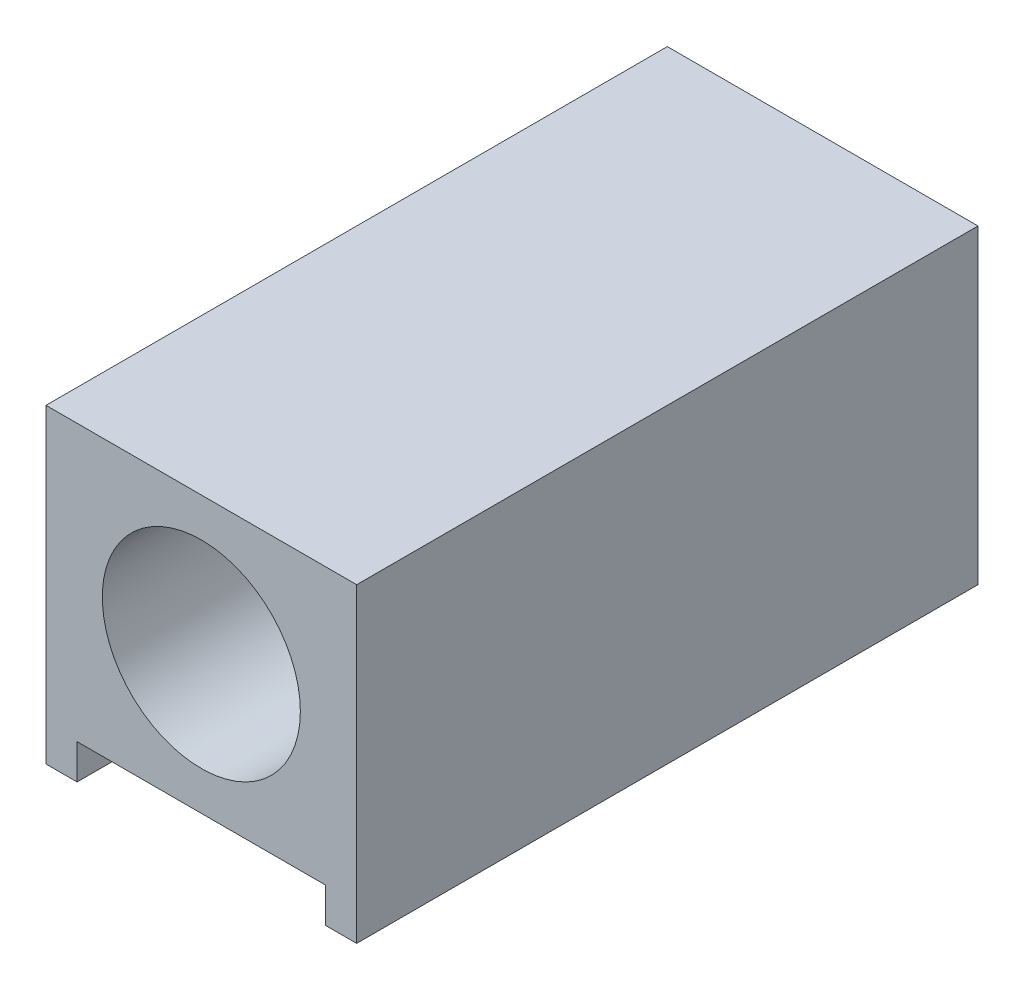
ISO-10303-21;
HEADER;
FILE_DESCRIPTION(('STEP AP214'),'2;1');
FILE_NAME('part.step','',(''),(''),'','','');
FILE_SCHEMA(('AUTOMOTIVE_DESIGN { 1 0 10303 214 1 1 1 1 }'));
ENDSEC;
DATA;
#1=APPLICATION_CONTEXT('core data for automotive mechanical design processes');
#2=APPLICATION_PROTOCOL_DEFINITION('international standard','automotive_design',2000,#1);
#3=PRODUCT_CONTEXT('',#1,'mechanical');
#4=PRODUCT('Part','Part','',(#3));
#5=PRODUCT_RELATED_PRODUCT_CATEGORY('part','',(#4));
#6=PRODUCT_DEFINITION_FORMATION('','',#4);
#7=PRODUCT_DEFINITION_CONTEXT('part definition',#1,'design');
#8=PRODUCT_DEFINITION('design','',#6,#7);
#9=PRODUCT_DEFINITION_SHAPE('','',#8);
#10=(LENGTH_UNIT() NAMED_UNIT(*) SI_UNIT(.MILLI.,.METRE.));
#11=(NAMED_UNIT(*) PLANE_ANGLE_UNIT() SI_UNIT($,.RADIAN.));
#12=(NAMED_UNIT(*) SI_UNIT($,.STERADIAN.) SOLID_ANGLE_UNIT());
#13=UNCERTAINTY_MEASURE_WITH_UNIT(LENGTH_MEASURE(1.E-05),#10,'distance_accuracy_value','');
#14=(GEOMETRIC_REPRESENTATION_CONTEXT(3) GLOBAL_UNCERTAINTY_ASSIGNED_CONTEXT((#13)) GLOBAL_UNIT_ASSIGNED_CONTEXT((#10,
#11,#12)) REPRESENTATION_CONTEXT('',''));
#15=CARTESIAN_POINT('',(0.,0.,0.));
#16=DIRECTION('',(0.,0.,1.));
#17=DIRECTION('',(1.,0.,0.));
#18=AXIS2_PLACEMENT_3D('',#15,#16,#17);
#19=CARTESIAN_POINT('',(0.,0.,0.));
#20=DIRECTION('',(0.,1.,0.));
#21=DIRECTION('',(0.,0.,1.));
#22=AXIS2_PLACEMENT_3D('',#19,#20,#21);
#23=PLANE('',#22);
#24=DIRECTION('',(1.,0.,0.));
#25=VECTOR('',#24,1.);
#26=CARTESIAN_POINT('',(-10.5609065155807,0.,12.71388101983));
#27=LINE('',#26,#25);
#28=CARTESIAN_POINT('',(-8.96090651558074,0.,12.71388101983));
#29=VERTEX_POINT('',#28);
#30=CARTESIAN_POINT('',(3.83909348441926,0.,12.71388101983));
#31=VERTEX_POINT('',#30);
#32=EDGE_CURVE('E192',#29,#31,#27,.T.);
#33=ORIENTED_EDGE('',*,*,#32,.F.);
#34=DIRECTION('',(0.,0.,1.));
#35=VECTOR('',#34,1.);
#36=CARTESIAN_POINT('',(-8.96090651558074,0.,-19.28611898017));
#37=LINE('',#36,#35);
#38=CARTESIAN_POINT('',(-8.96090651558074,0.,-19.28611898017));
#39=VERTEX_POINT('',#38);
#40=EDGE_CURVE('E174',#39,#29,#37,.T.);
#41=ORIENTED_EDGE('',*,*,#40,.F.);
#42=DIRECTION('',(-1.,0.,0.));
#43=VECTOR('',#42,1.);
#44=CARTESIAN_POINT('',(-10.5609065155807,0.,-19.28611898017));
#45=LINE('',#44,#43);
#46=CARTESIAN_POINT('',(3.83909348441926,0.,-19.28611898017));
#47=VERTEX_POINT('',#46);
#48=EDGE_CURVE('E197',#47,#39,#45,.T.);
#49=ORIENTED_EDGE('',*,*,#48,.F.);
#50=DIRECTION('',(0.,0.,-1.));
#51=VECTOR('',#50,1.);
#52=CARTESIAN_POINT('',(3.83909348441926,0.,-19.28611898017));
#53=LINE('',#52,#51);
#54=EDGE_CURVE('E161',#31,#47,#53,.T.);
#55=ORIENTED_EDGE('',*,*,#54,.F.);
#56=EDGE_LOOP('',(#33,#41,#49,#55));
#57=FACE_BOUND('',#56,.T.);
#58=ADVANCED_FACE('F33',(#57),#23,.F.);
#59=CARTESIAN_POINT('',(-10.5609065155807,14.2,-19.28611898017));
#60=DIRECTION('',(1.,0.,0.));
#61=DIRECTION('',(0.,0.,-1.));
#62=AXIS2_PLACEMENT_3D('',#59,#60,#61);
#63=PLANE('',#62);
#64=DIRECTION('',(0.,-1.,0.));
#65=VECTOR('',#64,1.);
#66=CARTESIAN_POINT('',(-10.5609065155807,14.2,-19.28611898017));
#67=LINE('',#66,#65);
#68=CARTESIAN_POINT('',(-10.5609065155807,14.2,-19.28611898017));
#69=VERTEX_POINT('',#68);
#70=CARTESIAN_POINT('',(-10.5609065155807,-1.8,-19.28611898017));
#71=VERTEX_POINT('',#70);
#72=EDGE_CURVE('E202',#69,#71,#67,.T.);
#73=ORIENTED_EDGE('',*,*,#72,.T.);
#74=DIRECTION('',(0.,0.,-1.));
#75=VECTOR('',#74,1.);
#76=CARTESIAN_POINT('',(-10.5609065155807,-1.8,-19.28611898017));
#77=LINE('',#76,#75);
#78=CARTESIAN_POINT('',(-10.5609065155807,-1.8,12.71388101983));
#79=VERTEX_POINT('',#78);
#80=EDGE_CURVE('E175',#79,#71,#77,.T.);
#81=ORIENTED_EDGE('',*,*,#80,.F.);
#82=DIRECTION('',(0.,-1.,0.));
#83=VECTOR('',#82,1.);
#84=CARTESIAN_POINT('',(-10.5609065155807,14.2,12.71388101983));
#85=LINE('',#84,#83);
#86=CARTESIAN_POINT('',(-10.5609065155807,14.2,12.71388101983));
#87=VERTEX_POINT('',#86);
#88=EDGE_CURVE('E145',#87,#79,#85,.T.);
#89=ORIENTED_EDGE('',*,*,#88,.F.);
#90=DIRECTION('',(0.,0.,1.));
#91=VECTOR('',#90,1.);
#92=CARTESIAN_POINT('',(-10.5609065155807,14.2,-19.28611898017));
#93=LINE('',#92,#91);
#94=EDGE_CURVE('E193',#69,#87,#93,.T.);
#95=ORIENTED_EDGE('',*,*,#94,.F.);
#96=EDGE_LOOP('',(#73,#81,#89,#95));
#97=FACE_BOUND('',#96,.T.);
#98=ADVANCED_FACE('F287',(#97),#63,.F.);
#99=CARTESIAN_POINT('',(-10.5609065155807,14.2,12.71388101983));
#100=DIRECTION('',(0.,0.,-1.));
#101=DIRECTION('',(-1.,0.,0.));
#102=AXIS2_PLACEMENT_3D('',#99,#100,#101);
#103=PLANE('',#102);
#104=CARTESIAN_POINT('',(-2.56090651558074,7.1,12.71388101983));
#105=DIRECTION('',(0.,0.,1.));
#106=DIRECTION('',(1.,0.,0.));
#107=AXIS2_PLACEMENT_3D('',#104,#105,#106);
#108=CIRCLE('',#107,5.1);
#109=CARTESIAN_POINT('',(2.53909348441926,7.1,12.71388101983));
#110=VERTEX_POINT('',#109);
#111=EDGE_CURVE('E163',#110,#110,#108,.T.);
#112=ORIENTED_EDGE('',*,*,#111,.F.);
#113=EDGE_LOOP('',(#112));
#114=FACE_BOUND('',#113,.T.);
#115=ORIENTED_EDGE('',*,*,#88,.T.);
#116=DIRECTION('',(-1.,0.,0.));
#117=VECTOR('',#116,1.);
#118=CARTESIAN_POINT('',(-10.5609065155807,-1.8,12.71388101983));
#119=LINE('',#118,#117);
#120=CARTESIAN_POINT('',(-8.96090651558074,-1.8,12.71388101983));
#121=VERTEX_POINT('',#120);
#122=EDGE_CURVE('E182',#121,#79,#119,.T.);
#123=ORIENTED_EDGE('',*,*,#122,.F.);
#124=DIRECTION('',(0.,1.,0.));
#125=VECTOR('',#124,1.);
#126=CARTESIAN_POINT('',(-8.96090651558074,-1.8,12.71388101983));
#127=LINE('',#126,#125);
#128=EDGE_CURVE('E185',#121,#29,#127,.T.);
#129=ORIENTED_EDGE('',*,*,#128,.T.);
#130=ORIENTED_EDGE('',*,*,#32,.T.);
#131=DIRECTION('',(0.,1.,0.));
#132=VECTOR('',#131,1.);
#133=CARTESIAN_POINT('',(3.83909348441926,-1.8,12.71388101983));
#134=LINE('',#133,#132);
#135=CARTESIAN_POINT('',(3.83909348441926,-1.8,12.71388101983));
#136=VERTEX_POINT('',#135);
#137=EDGE_CURVE('E152',#136,#31,#134,.T.);
#138=ORIENTED_EDGE('',*,*,#137,.F.);
#139=DIRECTION('',(-1.,0.,0.));
#140=VECTOR('',#139,1.);
#141=CARTESIAN_POINT('',(5.43909348441926,-1.8,12.71388101983));
#142=LINE('',#141,#140);
#143=CARTESIAN_POINT('',(5.43909348441926,-1.8,12.71388101983));
#144=VERTEX_POINT('',#143);
#145=EDGE_CURVE('E149',#144,#136,#142,.T.);
#146=ORIENTED_EDGE('',*,*,#145,.F.);
#147=DIRECTION('',(0.,-1.,0.));
#148=VECTOR('',#147,1.);
#149=CARTESIAN_POINT('',(5.43909348441926,14.2,12.71388101983));
#150=LINE('',#149,#148);
#151=CARTESIAN_POINT('',(5.43909348441926,14.2,12.71388101983));
#152=VERTEX_POINT('',#151);
#153=EDGE_CURVE('E137',#152,#144,#150,.T.);
#154=ORIENTED_EDGE('',*,*,#153,.F.);
#155=DIRECTION('',(1.,0.,0.));
#156=VECTOR('',#155,1.);
#157=CARTESIAN_POINT('',(-10.5609065155807,14.2,12.71388101983));
#158=LINE('',#157,#156);
#159=EDGE_CURVE('E196',#87,#152,#158,.T.);
#160=ORIENTED_EDGE('',*,*,#159,.F.);
#161=EDGE_LOOP('',(#115,#123,#129,#130,#138,#146,#154,#160));
#162=FACE_BOUND('',#161,.T.);
#163=ADVANCED_FACE('F150',(#114,#162),#103,.F.);
#164=CARTESIAN_POINT('',(5.43909348441926,14.2,-19.28611898017));
#165=DIRECTION('',(-1.,0.,0.));
#166=DIRECTION('',(0.,0.,1.));
#167=AXIS2_PLACEMENT_3D('',#164,#165,#166);
#168=PLANE('',#167);
#169=ORIENTED_EDGE('',*,*,#153,.T.);
#170=DIRECTION('',(0.,0.,1.));
#171=VECTOR('',#170,1.);
#172=CARTESIAN_POINT('',(5.43909348441926,-1.8,-19.28611898017));
#173=LINE('',#172,#171);
#174=CARTESIAN_POINT('',(5.43909348441926,-1.8,-19.28611898017));
#175=VERTEX_POINT('',#174);
#176=EDGE_CURVE('E142',#175,#144,#173,.T.);
#177=ORIENTED_EDGE('',*,*,#176,.F.);
#178=DIRECTION('',(0.,-1.,0.));
#179=VECTOR('',#178,1.);
#180=CARTESIAN_POINT('',(5.43909348441926,14.2,-19.28611898017));
#181=LINE('',#180,#179);
#182=CARTESIAN_POINT('',(5.43909348441926,14.2,-19.28611898017));
#183=VERTEX_POINT('',#182);
#184=EDGE_CURVE('E146',#183,#175,#181,.T.);
#185=ORIENTED_EDGE('',*,*,#184,.F.);
#186=DIRECTION('',(0.,0.,-1.));
#187=VECTOR('',#186,1.);
#188=CARTESIAN_POINT('',(5.43909348441926,14.2,-19.28611898017));
#189=LINE('',#188,#187);
#190=EDGE_CURVE('E143',#152,#183,#189,.T.);
#191=ORIENTED_EDGE('',*,*,#190,.F.);
#192=EDGE_LOOP('',(#169,#177,#185,#191));
#193=FACE_BOUND('',#192,.T.);
#194=ADVANCED_FACE('F139',(#193),#168,.F.);
#195=CARTESIAN_POINT('',(-10.5609065155807,14.2,-19.28611898017));
#196=DIRECTION('',(0.,0.,1.));
#197=DIRECTION('',(1.,0.,0.));
#198=AXIS2_PLACEMENT_3D('',#195,#196,#197);
#199=PLANE('',#198);
#200=ORIENTED_EDGE('',*,*,#48,.T.);
#201=DIRECTION('',(0.,1.,0.));
#202=VECTOR('',#201,1.);
#203=CARTESIAN_POINT('',(-8.96090651558074,-1.8,-19.28611898017));
#204=LINE('',#203,#202);
#205=CARTESIAN_POINT('',(-8.96090651558074,-1.8,-19.28611898017));
#206=VERTEX_POINT('',#205);
#207=EDGE_CURVE('E189',#206,#39,#204,.T.);
#208=ORIENTED_EDGE('',*,*,#207,.F.);
#209=DIRECTION('',(1.,0.,0.));
#210=VECTOR('',#209,1.);
#211=CARTESIAN_POINT('',(-10.5609065155807,-1.8,-19.28611898017));
#212=LINE('',#211,#210);
#213=EDGE_CURVE('E178',#71,#206,#212,.T.);
#214=ORIENTED_EDGE('',*,*,#213,.F.);
#215=ORIENTED_EDGE('',*,*,#72,.F.);
#216=DIRECTION('',(-1.,0.,0.));
#217=VECTOR('',#216,1.);
#218=CARTESIAN_POINT('',(-10.5609065155807,14.2,-19.28611898017));
#219=LINE('',#218,#217);
#220=EDGE_CURVE('E200',#183,#69,#219,.T.);
#221=ORIENTED_EDGE('',*,*,#220,.F.);
#222=ORIENTED_EDGE('',*,*,#184,.T.);
#223=DIRECTION('',(1.,0.,0.));
#224=VECTOR('',#223,1.);
#225=CARTESIAN_POINT('',(5.43909348441926,-1.8,-19.28611898017));
#226=LINE('',#225,#224);
#227=CARTESIAN_POINT('',(3.83909348441926,-1.8,-19.28611898017));
#228=VERTEX_POINT('',#227);
#229=EDGE_CURVE('E160',#228,#175,#226,.T.);
#230=ORIENTED_EDGE('',*,*,#229,.F.);
#231=DIRECTION('',(0.,1.,0.));
#232=VECTOR('',#231,1.);
#233=CARTESIAN_POINT('',(3.83909348441926,-1.8,-19.28611898017));
#234=LINE('',#233,#232);
#235=EDGE_CURVE('E169',#228,#47,#234,.T.);
#236=ORIENTED_EDGE('',*,*,#235,.T.);
#237=EDGE_LOOP('',(#200,#208,#214,#215,#221,#222,#230,#236));
#238=FACE_BOUND('',#237,.T.);
#239=DIRECTION('',(0.,-1.,0.));
#240=VECTOR('',#239,1.);
#241=CARTESIAN_POINT('',(-1.56090651558074,13.,-19.28611898017));
#242=LINE('',#241,#240);
#243=CARTESIAN_POINT('',(-1.56090651558074,11.2,-19.28611898017));
#244=VERTEX_POINT('',#243);
#245=CARTESIAN_POINT('',(-1.56090651558074,3.,-19.28611898017));
#246=VERTEX_POINT('',#245);
#247=EDGE_CURVE('E252',#244,#246,#242,.T.);
#248=ORIENTED_EDGE('',*,*,#247,.F.);
#249=CARTESIAN_POINT('',(-2.56090651558074,11.2,-19.28611898017));
#250=DIRECTION('',(0.,0.,1.));
#251=DIRECTION('',(1.,0.,0.));
#252=AXIS2_PLACEMENT_3D('',#249,#250,#251);
#253=CIRCLE('',#252,1.);
#254=CARTESIAN_POINT('',(-2.56090651558075,12.2,-19.28611898017));
#255=VERTEX_POINT('',#254);
#256=EDGE_CURVE('E57',#244,#255,#253,.T.);
#257=ORIENTED_EDGE('',*,*,#256,.T.);
#258=CARTESIAN_POINT('',(-2.56090651558074,11.2,-19.28611898017));
#259=DIRECTION('',(0.,0.,1.));
#260=DIRECTION('',(1.,0.,0.));
#261=AXIS2_PLACEMENT_3D('',#258,#259,#260);
#262=CIRCLE('',#261,1.);
#263=CARTESIAN_POINT('',(-3.56090651558074,11.2,-19.28611898017));
#264=VERTEX_POINT('',#263);
#265=EDGE_CURVE('E223',#255,#264,#262,.T.);
#266=ORIENTED_EDGE('',*,*,#265,.T.);
#267=DIRECTION('',(0.,-1.,0.));
#268=VECTOR('',#267,1.);
#269=CARTESIAN_POINT('',(-3.56090651558074,13.,-19.28611898017));
#270=LINE('',#269,#268);
#271=CARTESIAN_POINT('',(-3.56090651558074,3.,-19.28611898017));
#272=VERTEX_POINT('',#271);
#273=EDGE_CURVE('E236',#264,#272,#270,.T.);
#274=ORIENTED_EDGE('',*,*,#273,.T.);
#275=CARTESIAN_POINT('',(-2.56090651558074,3.,-19.28611898017));
#276=DIRECTION('',(0.,0.,1.));
#277=DIRECTION('',(1.,0.,0.));
#278=AXIS2_PLACEMENT_3D('',#275,#276,#277);
#279=CIRCLE('',#278,1.);
#280=CARTESIAN_POINT('',(-2.56090651558075,2.,-19.28611898017));
#281=VERTEX_POINT('',#280);
#282=EDGE_CURVE('E50',#272,#281,#279,.T.);
#283=ORIENTED_EDGE('',*,*,#282,.T.);
#284=CARTESIAN_POINT('',(-2.56090651558074,3.,-19.28611898017));
#285=DIRECTION('',(0.,0.,1.));
#286=DIRECTION('',(1.,0.,0.));
#287=AXIS2_PLACEMENT_3D('',#284,#285,#286);
#288=CIRCLE('',#287,1.);
#289=EDGE_CURVE('E42',#281,#246,#288,.T.);
#290=ORIENTED_EDGE('',*,*,#289,.T.);
#291=EDGE_LOOP('',(#248,#257,#266,#274,#283,#290));
#292=FACE_BOUND('',#291,.T.);
#293=ADVANCED_FACE('F251',(#238,#292),#199,.F.);
#294=CARTESIAN_POINT('',(0.,14.2,0.));
#295=DIRECTION('',(0.,1.,0.));
#296=DIRECTION('',(0.,0.,1.));
#297=AXIS2_PLACEMENT_3D('',#294,#295,#296);
#298=PLANE('',#297);
#299=ORIENTED_EDGE('',*,*,#94,.T.);
#300=ORIENTED_EDGE('',*,*,#159,.T.);
#301=ORIENTED_EDGE('',*,*,#190,.T.);
#302=ORIENTED_EDGE('',*,*,#220,.T.);
#303=EDGE_LOOP('',(#299,#300,#301,#302));
#304=FACE_BOUND('',#303,.T.);
#305=ADVANCED_FACE('F297',(#304),#298,.T.);
#306=CARTESIAN_POINT('',(-8.96090651558074,-1.8,-19.28611898017));
#307=DIRECTION('',(-1.,0.,0.));
#308=DIRECTION('',(0.,0.,1.));
#309=AXIS2_PLACEMENT_3D('',#306,#307,#308);
#310=PLANE('',#309);
#311=ORIENTED_EDGE('',*,*,#40,.T.);
#312=ORIENTED_EDGE('',*,*,#128,.F.);
#313=DIRECTION('',(0.,0.,1.));
#314=VECTOR('',#313,1.);
#315=CARTESIAN_POINT('',(-8.96090651558074,-1.8,-19.28611898017));
#316=LINE('',#315,#314);
#317=EDGE_CURVE('E180',#206,#121,#316,.T.);
#318=ORIENTED_EDGE('',*,*,#317,.F.);
#319=ORIENTED_EDGE('',*,*,#207,.T.);
#320=EDGE_LOOP('',(#311,#312,#318,#319));
#321=FACE_BOUND('',#320,.T.);
#322=ADVANCED_FACE('F327',(#321),#310,.F.);
#323=CARTESIAN_POINT('',(0.,-1.8,0.));
#324=DIRECTION('',(0.,1.,0.));
#325=DIRECTION('',(0.,0.,1.));
#326=AXIS2_PLACEMENT_3D('',#323,#324,#325);
#327=PLANE('',#326);
#328=ORIENTED_EDGE('',*,*,#80,.T.);
#329=ORIENTED_EDGE('',*,*,#213,.T.);
#330=ORIENTED_EDGE('',*,*,#317,.T.);
#331=ORIENTED_EDGE('',*,*,#122,.T.);
#332=EDGE_LOOP('',(#328,#329,#330,#331));
#333=FACE_BOUND('',#332,.T.);
#334=ADVANCED_FACE('F324',(#333),#327,.F.);
#335=CARTESIAN_POINT('',(3.83909348441926,-1.8,-19.28611898017));
#336=DIRECTION('',(1.,0.,0.));
#337=DIRECTION('',(0.,0.,-1.));
#338=AXIS2_PLACEMENT_3D('',#335,#336,#337);
#339=PLANE('',#338);
#340=ORIENTED_EDGE('',*,*,#54,.T.);
#341=ORIENTED_EDGE('',*,*,#235,.F.);
#342=DIRECTION('',(0.,0.,-1.));
#343=VECTOR('',#342,1.);
#344=CARTESIAN_POINT('',(3.83909348441926,-1.8,-19.28611898017));
#345=LINE('',#344,#343);
#346=EDGE_CURVE('E155',#136,#228,#345,.T.);
#347=ORIENTED_EDGE('',*,*,#346,.F.);
#348=ORIENTED_EDGE('',*,*,#137,.T.);
#349=EDGE_LOOP('',(#340,#341,#347,#348));
#350=FACE_BOUND('',#349,.T.);
#351=ADVANCED_FACE('F318',(#350),#339,.F.);
#352=CARTESIAN_POINT('',(0.,-1.8,0.));
#353=DIRECTION('',(0.,-1.,0.));
#354=DIRECTION('',(0.,0.,-1.));
#355=AXIS2_PLACEMENT_3D('',#352,#353,#354);
#356=PLANE('',#355);
#357=ORIENTED_EDGE('',*,*,#176,.T.);
#358=ORIENTED_EDGE('',*,*,#145,.T.);
#359=ORIENTED_EDGE('',*,*,#346,.T.);
#360=ORIENTED_EDGE('',*,*,#229,.T.);
#361=EDGE_LOOP('',(#357,#358,#359,#360));
#362=FACE_BOUND('',#361,.T.);
#363=ADVANCED_FACE('F158',(#362),#356,.T.);
#364=CARTESIAN_POINT('',(-2.56090651558074,7.1,-19.28611898017));
#365=DIRECTION('',(0.,0.,1.));
#366=DIRECTION('',(1.,0.,0.));
#367=AXIS2_PLACEMENT_3D('',#364,#365,#366);
#368=CYLINDRICAL_SURFACE('',#367,5.1);
#369=CARTESIAN_POINT('',(-2.56090651558074,7.1,-17.68611898017));
#370=DIRECTION('',(0.,0.,1.));
#371=DIRECTION('',(1.,0.,0.));
#372=AXIS2_PLACEMENT_3D('',#369,#370,#371);
#373=CIRCLE('',#372,5.1);
#374=CARTESIAN_POINT('',(-2.56090651558075,2.,-17.68611898017));
#375=VERTEX_POINT('',#374);
#376=CARTESIAN_POINT('',(-2.56090651558075,12.2,-17.68611898017));
#377=VERTEX_POINT('',#376);
#378=EDGE_CURVE('E210',#375,#377,#373,.F.);
#379=ORIENTED_EDGE('',*,*,#378,.T.);
#380=CARTESIAN_POINT('',(-2.56090651558074,7.1,-17.68611898017));
#381=DIRECTION('',(0.,0.,1.));
#382=DIRECTION('',(1.,0.,0.));
#383=AXIS2_PLACEMENT_3D('',#380,#381,#382);
#384=CIRCLE('',#383,5.1);
#385=EDGE_CURVE('E208',#377,#375,#384,.F.);
#386=ORIENTED_EDGE('',*,*,#385,.T.);
#387=EDGE_LOOP('',(#379,#386));
#388=FACE_BOUND('',#387,.T.);
#389=ORIENTED_EDGE('',*,*,#111,.T.);
#390=EDGE_LOOP('',(#389));
#391=FACE_BOUND('',#390,.T.);
#392=ADVANCED_FACE('F310',(#388,#391),#368,.F.);
#393=CARTESIAN_POINT('',(-1.56090651558074,13.,-19.28611898017));
#394=DIRECTION('',(-1.,0.,0.));
#395=DIRECTION('',(0.,0.,1.));
#396=AXIS2_PLACEMENT_3D('',#393,#394,#395);
#397=PLANE('',#396);
#398=DIRECTION('',(0.,-1.,0.));
#399=VECTOR('',#398,1.);
#400=CARTESIAN_POINT('',(-1.56090651558074,13.,-17.68611898017));
#401=LINE('',#400,#399);
#402=CARTESIAN_POINT('',(-1.56090651558074,11.2,-17.68611898017));
#403=VERTEX_POINT('',#402);
#404=CARTESIAN_POINT('',(-1.56090651558074,3.,-17.68611898017));
#405=VERTEX_POINT('',#404);
#406=EDGE_CURVE('E258',#403,#405,#401,.T.);
#407=ORIENTED_EDGE('',*,*,#406,.F.);
#408=DIRECTION('',(0.,0.,1.));
#409=VECTOR('',#408,1.);
#410=CARTESIAN_POINT('',(-1.56090651558074,11.2,-19.28611898017));
#411=LINE('',#410,#409);
#412=EDGE_CURVE('E221',#403,#244,#411,.F.);
#413=ORIENTED_EDGE('',*,*,#412,.T.);
#414=ORIENTED_EDGE('',*,*,#247,.T.);
#415=DIRECTION('',(0.,0.,1.));
#416=VECTOR('',#415,1.);
#417=CARTESIAN_POINT('',(-1.56090651558074,3.,-19.28611898017));
#418=LINE('',#417,#416);
#419=EDGE_CURVE('E219',#246,#405,#418,.T.);
#420=ORIENTED_EDGE('',*,*,#419,.T.);
#421=EDGE_LOOP('',(#407,#413,#414,#420));
#422=FACE_BOUND('',#421,.T.);
#423=ADVANCED_FACE('F255',(#422),#397,.T.);
#424=CARTESIAN_POINT('',(3.83909348441926,13.,-17.68611898017));
#425=DIRECTION('',(0.,0.,1.));
#426=DIRECTION('',(1.,0.,0.));
#427=AXIS2_PLACEMENT_3D('',#424,#425,#426);
#428=PLANE('',#427);
#429=ORIENTED_EDGE('',*,*,#385,.F.);
#430=CARTESIAN_POINT('',(-2.56090651558074,11.2,-17.68611898017));
#431=DIRECTION('',(0.,0.,1.));
#432=DIRECTION('',(1.,0.,0.));
#433=AXIS2_PLACEMENT_3D('',#430,#431,#432);
#434=CIRCLE('',#433,1.);
#435=EDGE_CURVE('E228',#377,#403,#434,.F.);
#436=ORIENTED_EDGE('',*,*,#435,.T.);
#437=ORIENTED_EDGE('',*,*,#406,.T.);
#438=CARTESIAN_POINT('',(-2.56090651558074,3.,-17.68611898017));
#439=DIRECTION('',(0.,0.,1.));
#440=DIRECTION('',(1.,0.,0.));
#441=AXIS2_PLACEMENT_3D('',#438,#439,#440);
#442=CIRCLE('',#441,1.);
#443=EDGE_CURVE('E11',#405,#375,#442,.F.);
#444=ORIENTED_EDGE('',*,*,#443,.T.);
#445=EDGE_LOOP('',(#429,#436,#437,#444));
#446=FACE_BOUND('',#445,.T.);
#447=ADVANCED_FACE('F274',(#446),#428,.T.);
#448=CARTESIAN_POINT('',(-8.96090651558074,13.,-17.68611898017));
#449=DIRECTION('',(0.,0.,1.));
#450=DIRECTION('',(1.,0.,0.));
#451=AXIS2_PLACEMENT_3D('',#448,#449,#450);
#452=PLANE('',#451);
#453=ORIENTED_EDGE('',*,*,#378,.F.);
#454=CARTESIAN_POINT('',(-2.56090651558074,3.,-17.68611898017));
#455=DIRECTION('',(0.,0.,1.));
#456=DIRECTION('',(1.,0.,0.));
#457=AXIS2_PLACEMENT_3D('',#454,#455,#456);
#458=CIRCLE('',#457,1.);
#459=CARTESIAN_POINT('',(-3.56090651558074,3.,-17.68611898017));
#460=VERTEX_POINT('',#459);
#461=EDGE_CURVE('E231',#375,#460,#458,.F.);
#462=ORIENTED_EDGE('',*,*,#461,.T.);
#463=DIRECTION('',(0.,-1.,0.));
#464=VECTOR('',#463,1.);
#465=CARTESIAN_POINT('',(-3.56090651558074,13.,-17.68611898017));
#466=LINE('',#465,#464);
#467=CARTESIAN_POINT('',(-3.56090651558074,11.2,-17.68611898017));
#468=VERTEX_POINT('',#467);
#469=EDGE_CURVE('E239',#468,#460,#466,.T.);
#470=ORIENTED_EDGE('',*,*,#469,.F.);
#471=CARTESIAN_POINT('',(-2.56090651558074,11.2,-17.68611898017));
#472=DIRECTION('',(0.,0.,1.));
#473=DIRECTION('',(1.,0.,0.));
#474=AXIS2_PLACEMENT_3D('',#471,#472,#473);
#475=CIRCLE('',#474,1.);
#476=EDGE_CURVE('E225',#468,#377,#475,.F.);
#477=ORIENTED_EDGE('',*,*,#476,.T.);
#478=EDGE_LOOP('',(#453,#462,#470,#477));
#479=FACE_BOUND('',#478,.T.);
#480=ADVANCED_FACE('F270',(#479),#452,.T.);
#481=CARTESIAN_POINT('',(-3.56090651558074,13.,-19.28611898017));
#482=DIRECTION('',(1.,0.,0.));
#483=DIRECTION('',(0.,0.,-1.));
#484=AXIS2_PLACEMENT_3D('',#481,#482,#483);
#485=PLANE('',#484);
#486=ORIENTED_EDGE('',*,*,#273,.F.);
#487=DIRECTION('',(0.,0.,1.));
#488=VECTOR('',#487,1.);
#489=CARTESIAN_POINT('',(-3.56090651558074,11.2,-19.28611898017));
#490=LINE('',#489,#488);
#491=EDGE_CURVE('E216',#264,#468,#490,.T.);
#492=ORIENTED_EDGE('',*,*,#491,.T.);
#493=ORIENTED_EDGE('',*,*,#469,.T.);
#494=DIRECTION('',(0.,0.,1.));
#495=VECTOR('',#494,1.);
#496=CARTESIAN_POINT('',(-3.56090651558074,3.,-19.28611898017));
#497=LINE('',#496,#495);
#498=EDGE_CURVE('E213',#460,#272,#497,.F.);
#499=ORIENTED_EDGE('',*,*,#498,.T.);
#500=EDGE_LOOP('',(#486,#492,#493,#499));
#501=FACE_BOUND('',#500,.T.);
#502=ADVANCED_FACE('F266',(#501),#485,.T.);
#503=CARTESIAN_POINT('',(-2.56090651558074,11.2,-19.28611898017));
#504=DIRECTION('',(0.,0.,1.));
#505=DIRECTION('',(1.,0.,0.));
#506=AXIS2_PLACEMENT_3D('',#503,#504,#505);
#507=CYLINDRICAL_SURFACE('',#506,1.);
#508=ORIENTED_EDGE('',*,*,#412,.F.);
#509=ORIENTED_EDGE('',*,*,#435,.F.);
#510=DIRECTION('',(0.,0.,1.));
#511=VECTOR('',#510,1.);
#512=CARTESIAN_POINT('',(-2.56090651558075,12.2,-19.28611898017));
#513=LINE('',#512,#511);
#514=EDGE_CURVE('E234',#255,#377,#513,.T.);
#515=ORIENTED_EDGE('',*,*,#514,.F.);
#516=ORIENTED_EDGE('',*,*,#256,.F.);
#517=EDGE_LOOP('',(#508,#509,#515,#516));
#518=FACE_BOUND('',#517,.T.);
#519=ADVANCED_FACE('F276',(#518),#507,.F.);
#520=CARTESIAN_POINT('',(-2.56090651558074,11.2,-19.28611898017));
#521=DIRECTION('',(0.,0.,1.));
#522=DIRECTION('',(1.,0.,0.));
#523=AXIS2_PLACEMENT_3D('',#520,#521,#522);
#524=CYLINDRICAL_SURFACE('',#523,1.);
#525=ORIENTED_EDGE('',*,*,#476,.F.);
#526=ORIENTED_EDGE('',*,*,#491,.F.);
#527=ORIENTED_EDGE('',*,*,#265,.F.);
#528=ORIENTED_EDGE('',*,*,#514,.T.);
#529=EDGE_LOOP('',(#525,#526,#527,#528));
#530=FACE_BOUND('',#529,.T.);
#531=ADVANCED_FACE('F277',(#530),#524,.F.);
#532=CARTESIAN_POINT('',(-2.56090651558074,3.,-19.28611898017));
#533=DIRECTION('',(0.,0.,1.));
#534=DIRECTION('',(1.,0.,0.));
#535=AXIS2_PLACEMENT_3D('',#532,#533,#534);
#536=CYLINDRICAL_SURFACE('',#535,1.);
#537=ORIENTED_EDGE('',*,*,#419,.F.);
#538=ORIENTED_EDGE('',*,*,#289,.F.);
#539=DIRECTION('',(0.,0.,1.));
#540=VECTOR('',#539,1.);
#541=CARTESIAN_POINT('',(-2.56090651558075,2.,-19.28611898017));
#542=LINE('',#541,#540);
#543=EDGE_CURVE('E37',#375,#281,#542,.F.);
#544=ORIENTED_EDGE('',*,*,#543,.F.);
#545=ORIENTED_EDGE('',*,*,#443,.F.);
#546=EDGE_LOOP('',(#537,#538,#544,#545));
#547=FACE_BOUND('',#546,.T.);
#548=ADVANCED_FACE('F35',(#547),#536,.F.);
#549=CARTESIAN_POINT('',(-2.56090651558074,3.,-19.28611898017));
#550=DIRECTION('',(0.,0.,1.));
#551=DIRECTION('',(1.,0.,0.));
#552=AXIS2_PLACEMENT_3D('',#549,#550,#551);
#553=CYLINDRICAL_SURFACE('',#552,1.);
#554=ORIENTED_EDGE('',*,*,#282,.F.);
#555=ORIENTED_EDGE('',*,*,#498,.F.);
#556=ORIENTED_EDGE('',*,*,#461,.F.);
#557=ORIENTED_EDGE('',*,*,#543,.T.);
#558=EDGE_LOOP('',(#554,#555,#556,#557));
#559=FACE_BOUND('',#558,.T.);
#560=ADVANCED_FACE('F245',(#559),#553,.F.);
#561=CLOSED_SHELL('',(#58,#98,#163,#194,#293,#305,#322,#334,#351,#363,#392,#423,#447,#480,#502,
#519,#531,#548,#560));
#562=MANIFOLD_SOLID_BREP('B2',#561);
#563=ADVANCED_BREP_SHAPE_REPRESENTATION('',(#18,#562),#14);
#564=SHAPE_DEFINITION_REPRESENTATION(#9,#563);
ENDSEC;
END-ISO-10303-21;
